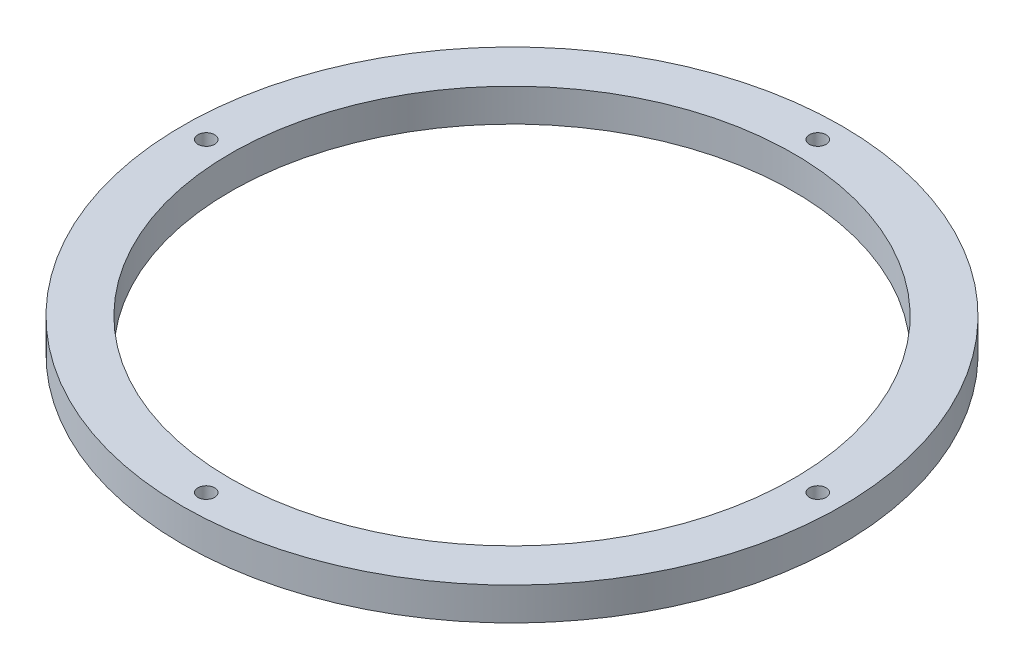
ISO-10303-21;
HEADER;
FILE_DESCRIPTION(('STEP AP214'),'2;1');
FILE_NAME('part.step','',(''),(''),'','','');
FILE_SCHEMA(('AUTOMOTIVE_DESIGN { 1 0 10303 214 1 1 1 1 }'));
ENDSEC;
DATA;
#1=APPLICATION_CONTEXT('core data for automotive mechanical design processes');
#2=APPLICATION_PROTOCOL_DEFINITION('international standard','automotive_design',2000,#1);
#3=PRODUCT_CONTEXT('',#1,'mechanical');
#4=PRODUCT('Part','Part','',(#3));
#5=PRODUCT_RELATED_PRODUCT_CATEGORY('part','',(#4));
#6=PRODUCT_DEFINITION_FORMATION('','',#4);
#7=PRODUCT_DEFINITION_CONTEXT('part definition',#1,'design');
#8=PRODUCT_DEFINITION('design','',#6,#7);
#9=PRODUCT_DEFINITION_SHAPE('','',#8);
#10=(LENGTH_UNIT() NAMED_UNIT(*) SI_UNIT(.MILLI.,.METRE.));
#11=(NAMED_UNIT(*) PLANE_ANGLE_UNIT() SI_UNIT($,.RADIAN.));
#12=(NAMED_UNIT(*) SI_UNIT($,.STERADIAN.) SOLID_ANGLE_UNIT());
#13=UNCERTAINTY_MEASURE_WITH_UNIT(LENGTH_MEASURE(1.E-05),#10,'distance_accuracy_value','');
#14=(GEOMETRIC_REPRESENTATION_CONTEXT(3) GLOBAL_UNCERTAINTY_ASSIGNED_CONTEXT((#13)) GLOBAL_UNIT_ASSIGNED_CONTEXT((#10,
#11,#12)) REPRESENTATION_CONTEXT('',''));
#15=CARTESIAN_POINT('',(0.,0.,0.));
#16=DIRECTION('',(0.,0.,1.));
#17=DIRECTION('',(1.,0.,0.));
#18=AXIS2_PLACEMENT_3D('',#15,#16,#17);
#19=CARTESIAN_POINT('',(0.,5.000000033,0.));
#20=DIRECTION('',(0.,1.,0.));
#21=DIRECTION('',(0.,0.,1.));
#22=AXIS2_PLACEMENT_3D('',#19,#20,#21);
#23=PLANE('',#22);
#24=CARTESIAN_POINT('',(93.125000059,5.000000033,0.));
#25=DIRECTION('',(0.,-1.,0.));
#26=DIRECTION('',(0.,0.,-1.));
#27=AXIS2_PLACEMENT_3D('',#24,#25,#26);
#28=CIRCLE('',#27,2.55270000000001);
#29=CARTESIAN_POINT('',(93.125000059,5.000000033,-2.55270000000001));
#30=VERTEX_POINT('',#29);
#31=EDGE_CURVE('E76',#30,#30,#28,.T.);
#32=ORIENTED_EDGE('',*,*,#31,.T.);
#33=EDGE_LOOP('',(#32));
#34=FACE_BOUND('',#33,.T.);
#35=CARTESIAN_POINT('',(0.,5.000000033,0.));
#36=DIRECTION('',(0.,1.,0.));
#37=DIRECTION('',(0.,0.,1.));
#38=AXIS2_PLACEMENT_3D('',#35,#36,#37);
#39=CIRCLE('',#38,85.74999995);
#40=CARTESIAN_POINT('',(0.,5.000000033,85.74999995));
#41=VERTEX_POINT('',#40);
#42=EDGE_CURVE('E42',#41,#41,#39,.T.);
#43=ORIENTED_EDGE('',*,*,#42,.F.);
#44=EDGE_LOOP('',(#43));
#45=FACE_BOUND('',#44,.T.);
#46=CARTESIAN_POINT('',(0.,5.000000033,0.));
#47=DIRECTION('',(0.,1.,0.));
#48=DIRECTION('',(0.,0.,1.));
#49=AXIS2_PLACEMENT_3D('',#46,#47,#48);
#50=CIRCLE('',#49,100.375000037);
#51=CARTESIAN_POINT('',(0.,5.000000033,100.375000037));
#52=VERTEX_POINT('',#51);
#53=EDGE_CURVE('E10',#52,#52,#50,.T.);
#54=ORIENTED_EDGE('',*,*,#53,.T.);
#55=EDGE_LOOP('',(#54));
#56=FACE_BOUND('',#55,.T.);
#57=CARTESIAN_POINT('',(-9.75432599657292E-13,5.000000033,93.125000059));
#58=DIRECTION('',(0.,-1.,0.));
#59=DIRECTION('',(0.,0.,-1.));
#60=AXIS2_PLACEMENT_3D('',#57,#58,#59);
#61=CIRCLE('',#60,2.5527);
#62=CARTESIAN_POINT('',(-9.75432599657292E-13,5.000000033,90.572300059));
#63=VERTEX_POINT('',#62);
#64=EDGE_CURVE('E47',#63,#63,#61,.T.);
#65=ORIENTED_EDGE('',*,*,#64,.T.);
#66=EDGE_LOOP('',(#65));
#67=FACE_BOUND('',#66,.T.);
#68=CARTESIAN_POINT('',(-93.125000059,5.000000033,0.));
#69=DIRECTION('',(0.,-1.,0.));
#70=DIRECTION('',(0.,0.,-1.));
#71=AXIS2_PLACEMENT_3D('',#68,#69,#70);
#72=CIRCLE('',#71,2.55270000000001);
#73=CARTESIAN_POINT('',(-93.125000059,5.000000033,-2.55270000000001));
#74=VERTEX_POINT('',#73);
#75=EDGE_CURVE('E58',#74,#74,#72,.T.);
#76=ORIENTED_EDGE('',*,*,#75,.T.);
#77=EDGE_LOOP('',(#76));
#78=FACE_BOUND('',#77,.T.);
#79=CARTESIAN_POINT('',(3.25144199885764E-13,5.000000033,-93.125000059));
#80=DIRECTION('',(0.,-1.,0.));
#81=DIRECTION('',(0.,0.,-1.));
#82=AXIS2_PLACEMENT_3D('',#79,#80,#81);
#83=CIRCLE('',#82,2.5527);
#84=CARTESIAN_POINT('',(3.25144199885764E-13,5.000000033,-95.677700059));
#85=VERTEX_POINT('',#84);
#86=EDGE_CURVE('E67',#85,#85,#83,.T.);
#87=ORIENTED_EDGE('',*,*,#86,.T.);
#88=EDGE_LOOP('',(#87));
#89=FACE_BOUND('',#88,.T.);
#90=ADVANCED_FACE('F31',(#34,#45,#56,#67,#78,#89),#23,.T.);
#91=CARTESIAN_POINT('',(0.,-5.000000033,0.));
#92=DIRECTION('',(0.,1.,0.));
#93=DIRECTION('',(0.,0.,1.));
#94=AXIS2_PLACEMENT_3D('',#91,#92,#93);
#95=PLANE('',#94);
#96=CARTESIAN_POINT('',(93.125000059,-5.000000033,0.));
#97=DIRECTION('',(0.,-1.,0.));
#98=DIRECTION('',(0.,0.,-1.));
#99=AXIS2_PLACEMENT_3D('',#96,#97,#98);
#100=CIRCLE('',#99,4.88950000000001);
#101=CARTESIAN_POINT('',(93.125000059,-5.000000033,-4.88950000000001));
#102=VERTEX_POINT('',#101);
#103=EDGE_CURVE('E82',#102,#102,#100,.T.);
#104=ORIENTED_EDGE('',*,*,#103,.F.);
#105=EDGE_LOOP('',(#104));
#106=FACE_BOUND('',#105,.T.);
#107=CARTESIAN_POINT('',(3.25144199885764E-13,-5.000000033,-93.125000059));
#108=DIRECTION('',(0.,-1.,0.));
#109=DIRECTION('',(0.,0.,-1.));
#110=AXIS2_PLACEMENT_3D('',#107,#108,#109);
#111=CIRCLE('',#110,4.8895);
#112=CARTESIAN_POINT('',(3.25144199885764E-13,-5.000000033,-98.014500059));
#113=VERTEX_POINT('',#112);
#114=EDGE_CURVE('E73',#113,#113,#111,.T.);
#115=ORIENTED_EDGE('',*,*,#114,.F.);
#116=EDGE_LOOP('',(#115));
#117=FACE_BOUND('',#116,.T.);
#118=CARTESIAN_POINT('',(-93.125000059,-5.000000033,0.));
#119=DIRECTION('',(0.,-1.,0.));
#120=DIRECTION('',(0.,0.,-1.));
#121=AXIS2_PLACEMENT_3D('',#118,#119,#120);
#122=CIRCLE('',#121,4.88950000000001);
#123=CARTESIAN_POINT('',(-93.125000059,-5.000000033,-4.88950000000001));
#124=VERTEX_POINT('',#123);
#125=EDGE_CURVE('E64',#124,#124,#122,.T.);
#126=ORIENTED_EDGE('',*,*,#125,.F.);
#127=EDGE_LOOP('',(#126));
#128=FACE_BOUND('',#127,.T.);
#129=CARTESIAN_POINT('',(-9.75432599657292E-13,-5.000000033,93.125000059));
#130=DIRECTION('',(0.,-1.,0.));
#131=DIRECTION('',(0.,0.,-1.));
#132=AXIS2_PLACEMENT_3D('',#129,#130,#131);
#133=CIRCLE('',#132,4.8895);
#134=CARTESIAN_POINT('',(-9.75432599657292E-13,-5.000000033,88.235500059));
#135=VERTEX_POINT('',#134);
#136=EDGE_CURVE('E55',#135,#135,#133,.T.);
#137=ORIENTED_EDGE('',*,*,#136,.F.);
#138=EDGE_LOOP('',(#137));
#139=FACE_BOUND('',#138,.T.);
#140=CARTESIAN_POINT('',(0.,-5.000000033,0.));
#141=DIRECTION('',(0.,1.,0.));
#142=DIRECTION('',(0.,0.,1.));
#143=AXIS2_PLACEMENT_3D('',#140,#141,#142);
#144=CIRCLE('',#143,100.375000037);
#145=CARTESIAN_POINT('',(0.,-5.000000033,100.375000037));
#146=VERTEX_POINT('',#145);
#147=EDGE_CURVE('E35',#146,#146,#144,.T.);
#148=ORIENTED_EDGE('',*,*,#147,.F.);
#149=EDGE_LOOP('',(#148));
#150=FACE_BOUND('',#149,.T.);
#151=CARTESIAN_POINT('',(0.,-5.000000033,0.));
#152=DIRECTION('',(0.,1.,0.));
#153=DIRECTION('',(0.,0.,1.));
#154=AXIS2_PLACEMENT_3D('',#151,#152,#153);
#155=CIRCLE('',#154,85.74999995);
#156=CARTESIAN_POINT('',(0.,-5.000000033,85.74999995));
#157=VERTEX_POINT('',#156);
#158=EDGE_CURVE('E44',#157,#157,#155,.T.);
#159=ORIENTED_EDGE('',*,*,#158,.T.);
#160=EDGE_LOOP('',(#159));
#161=FACE_BOUND('',#160,.T.);
#162=ADVANCED_FACE('F88',(#106,#117,#128,#139,#150,#161),#95,.F.);
#163=CARTESIAN_POINT('',(0.,5.000000033,0.));
#164=DIRECTION('',(0.,-1.,0.));
#165=DIRECTION('',(0.,0.,-1.));
#166=AXIS2_PLACEMENT_3D('',#163,#164,#165);
#167=CYLINDRICAL_SURFACE('',#166,100.375000037);
#168=ORIENTED_EDGE('',*,*,#53,.F.);
#169=EDGE_LOOP('',(#168));
#170=FACE_BOUND('',#169,.T.);
#171=ORIENTED_EDGE('',*,*,#147,.T.);
#172=EDGE_LOOP('',(#171));
#173=FACE_BOUND('',#172,.T.);
#174=ADVANCED_FACE('F33',(#170,#173),#167,.T.);
#175=CARTESIAN_POINT('',(0.,5.000000033,0.));
#176=DIRECTION('',(0.,-1.,0.));
#177=DIRECTION('',(0.,0.,-1.));
#178=AXIS2_PLACEMENT_3D('',#175,#176,#177);
#179=CYLINDRICAL_SURFACE('',#178,85.74999995);
#180=ORIENTED_EDGE('',*,*,#42,.T.);
#181=EDGE_LOOP('',(#180));
#182=FACE_BOUND('',#181,.T.);
#183=ORIENTED_EDGE('',*,*,#158,.F.);
#184=EDGE_LOOP('',(#183));
#185=FACE_BOUND('',#184,.T.);
#186=ADVANCED_FACE('F101',(#182,#185),#179,.F.);
#187=CARTESIAN_POINT('',(-9.75432599657292E-13,-5.000000033,93.125000059));
#188=DIRECTION('',(0.,-1.,0.));
#189=DIRECTION('',(0.,0.,-1.));
#190=AXIS2_PLACEMENT_3D('',#187,#188,#189);
#191=CYLINDRICAL_SURFACE('',#190,2.5527);
#192=ORIENTED_EDGE('',*,*,#64,.F.);
#193=EDGE_LOOP('',(#192));
#194=FACE_BOUND('',#193,.T.);
#195=CARTESIAN_POINT('',(-9.75432599657292E-13,-3.03919201486493,93.125000059));
#196=DIRECTION('',(0.,-1.,0.));
#197=DIRECTION('',(0.,0.,-1.));
#198=AXIS2_PLACEMENT_3D('',#195,#196,#197);
#199=CIRCLE('',#198,2.5527);
#200=CARTESIAN_POINT('',(-9.75432599657292E-13,-3.03919201486493,90.572300059));
#201=VERTEX_POINT('',#200);
#202=EDGE_CURVE('E52',#201,#201,#199,.T.);
#203=ORIENTED_EDGE('',*,*,#202,.T.);
#204=EDGE_LOOP('',(#203));
#205=FACE_BOUND('',#204,.T.);
#206=ADVANCED_FACE('F103',(#194,#205),#191,.F.);
#207=CARTESIAN_POINT('',(-9.75432599657292E-13,-5.000000033,93.125000059));
#208=DIRECTION('',(0.,-1.,0.));
#209=DIRECTION('',(0.,0.,-1.));
#210=AXIS2_PLACEMENT_3D('',#207,#208,#209);
#211=CONICAL_SURFACE('',#210,4.8895,0.872664625997164);
#212=ORIENTED_EDGE('',*,*,#202,.F.);
#213=EDGE_LOOP('',(#212));
#214=FACE_BOUND('',#213,.T.);
#215=ORIENTED_EDGE('',*,*,#136,.T.);
#216=EDGE_LOOP('',(#215));
#217=FACE_BOUND('',#216,.T.);
#218=ADVANCED_FACE('F110',(#214,#217),#211,.F.);
#219=CARTESIAN_POINT('',(-93.125000059,-5.000000033,0.));
#220=DIRECTION('',(0.,-1.,0.));
#221=DIRECTION('',(0.,0.,-1.));
#222=AXIS2_PLACEMENT_3D('',#219,#220,#221);
#223=CYLINDRICAL_SURFACE('',#222,2.55270000000001);
#224=ORIENTED_EDGE('',*,*,#75,.F.);
#225=EDGE_LOOP('',(#224));
#226=FACE_BOUND('',#225,.T.);
#227=CARTESIAN_POINT('',(-93.125000059,-3.03919201486493,0.));
#228=DIRECTION('',(0.,-1.,0.));
#229=DIRECTION('',(0.,0.,-1.));
#230=AXIS2_PLACEMENT_3D('',#227,#228,#229);
#231=CIRCLE('',#230,2.55270000000001);
#232=CARTESIAN_POINT('',(-93.125000059,-3.03919201486493,-2.55270000000001));
#233=VERTEX_POINT('',#232);
#234=EDGE_CURVE('E61',#233,#233,#231,.T.);
#235=ORIENTED_EDGE('',*,*,#234,.T.);
#236=EDGE_LOOP('',(#235));
#237=FACE_BOUND('',#236,.T.);
#238=ADVANCED_FACE('F150',(#226,#237),#223,.F.);
#239=CARTESIAN_POINT('',(-93.125000059,-5.000000033,0.));
#240=DIRECTION('',(0.,-1.,0.));
#241=DIRECTION('',(0.,0.,-1.));
#242=AXIS2_PLACEMENT_3D('',#239,#240,#241);
#243=CONICAL_SURFACE('',#242,4.88950000000001,0.872664625997164);
#244=ORIENTED_EDGE('',*,*,#234,.F.);
#245=EDGE_LOOP('',(#244));
#246=FACE_BOUND('',#245,.T.);
#247=ORIENTED_EDGE('',*,*,#125,.T.);
#248=EDGE_LOOP('',(#247));
#249=FACE_BOUND('',#248,.T.);
#250=ADVANCED_FACE('F133',(#246,#249),#243,.F.);
#251=CARTESIAN_POINT('',(3.25144199885764E-13,-5.000000033,-93.125000059));
#252=DIRECTION('',(0.,-1.,0.));
#253=DIRECTION('',(0.,0.,-1.));
#254=AXIS2_PLACEMENT_3D('',#251,#252,#253);
#255=CYLINDRICAL_SURFACE('',#254,2.5527);
#256=ORIENTED_EDGE('',*,*,#86,.F.);
#257=EDGE_LOOP('',(#256));
#258=FACE_BOUND('',#257,.T.);
#259=CARTESIAN_POINT('',(3.25144199885764E-13,-3.03919201486493,-93.125000059));
#260=DIRECTION('',(0.,-1.,0.));
#261=DIRECTION('',(0.,0.,-1.));
#262=AXIS2_PLACEMENT_3D('',#259,#260,#261);
#263=CIRCLE('',#262,2.5527);
#264=CARTESIAN_POINT('',(3.25144199885764E-13,-3.03919201486493,-95.677700059));
#265=VERTEX_POINT('',#264);
#266=EDGE_CURVE('E70',#265,#265,#263,.T.);
#267=ORIENTED_EDGE('',*,*,#266,.T.);
#268=EDGE_LOOP('',(#267));
#269=FACE_BOUND('',#268,.T.);
#270=ADVANCED_FACE('F129',(#258,#269),#255,.F.);
#271=CARTESIAN_POINT('',(3.25144199885764E-13,-5.000000033,-93.125000059));
#272=DIRECTION('',(0.,-1.,0.));
#273=DIRECTION('',(0.,0.,-1.));
#274=AXIS2_PLACEMENT_3D('',#271,#272,#273);
#275=CONICAL_SURFACE('',#274,4.8895,0.872664625997164);
#276=ORIENTED_EDGE('',*,*,#266,.F.);
#277=EDGE_LOOP('',(#276));
#278=FACE_BOUND('',#277,.T.);
#279=ORIENTED_EDGE('',*,*,#114,.T.);
#280=EDGE_LOOP('',(#279));
#281=FACE_BOUND('',#280,.T.);
#282=ADVANCED_FACE('F132',(#278,#281),#275,.F.);
#283=CARTESIAN_POINT('',(93.125000059,-5.000000033,0.));
#284=DIRECTION('',(0.,-1.,0.));
#285=DIRECTION('',(0.,0.,-1.));
#286=AXIS2_PLACEMENT_3D('',#283,#284,#285);
#287=CYLINDRICAL_SURFACE('',#286,2.55270000000001);
#288=ORIENTED_EDGE('',*,*,#31,.F.);
#289=EDGE_LOOP('',(#288));
#290=FACE_BOUND('',#289,.T.);
#291=CARTESIAN_POINT('',(93.125000059,-3.03919201486493,0.));
#292=DIRECTION('',(0.,-1.,0.));
#293=DIRECTION('',(0.,0.,-1.));
#294=AXIS2_PLACEMENT_3D('',#291,#292,#293);
#295=CIRCLE('',#294,2.55270000000001);
#296=CARTESIAN_POINT('',(93.125000059,-3.03919201486493,-2.55270000000001));
#297=VERTEX_POINT('',#296);
#298=EDGE_CURVE('E79',#297,#297,#295,.T.);
#299=ORIENTED_EDGE('',*,*,#298,.T.);
#300=EDGE_LOOP('',(#299));
#301=FACE_BOUND('',#300,.T.);
#302=ADVANCED_FACE('F139',(#290,#301),#287,.F.);
#303=CARTESIAN_POINT('',(93.125000059,-5.000000033,0.));
#304=DIRECTION('',(0.,-1.,0.));
#305=DIRECTION('',(0.,0.,-1.));
#306=AXIS2_PLACEMENT_3D('',#303,#304,#305);
#307=CONICAL_SURFACE('',#306,4.88950000000001,0.872664625997164);
#308=ORIENTED_EDGE('',*,*,#298,.F.);
#309=EDGE_LOOP('',(#308));
#310=FACE_BOUND('',#309,.T.);
#311=ORIENTED_EDGE('',*,*,#103,.T.);
#312=EDGE_LOOP('',(#311));
#313=FACE_BOUND('',#312,.T.);
#314=ADVANCED_FACE('F86',(#310,#313),#307,.F.);
#315=CLOSED_SHELL('',(#90,#162,#174,#186,#206,#218,#238,#250,#270,#282,#302,#314));
#316=MANIFOLD_SOLID_BREP('B2',#315);
#317=ADVANCED_BREP_SHAPE_REPRESENTATION('',(#18,#316),#14);
#318=SHAPE_DEFINITION_REPRESENTATION(#9,#317);
ENDSEC;
END-ISO-10303-21;
